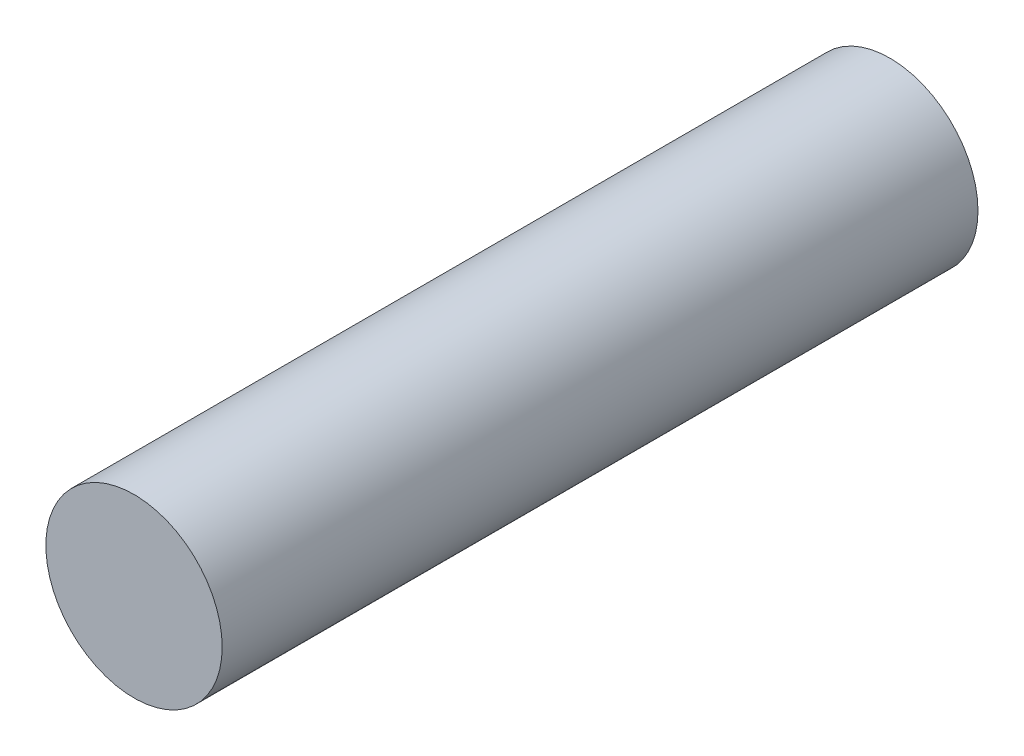
ISO-10303-21;
HEADER;
FILE_DESCRIPTION(('STEP AP214'),'2;1');
FILE_NAME('part.step','',(''),(''),'','','');
FILE_SCHEMA(('AUTOMOTIVE_DESIGN { 1 0 10303 214 1 1 1 1 }'));
ENDSEC;
DATA;
#1=APPLICATION_CONTEXT('core data for automotive mechanical design processes');
#2=APPLICATION_PROTOCOL_DEFINITION('international standard','automotive_design',2000,#1);
#3=PRODUCT_CONTEXT('',#1,'mechanical');
#4=PRODUCT('Part','Part','',(#3));
#5=PRODUCT_RELATED_PRODUCT_CATEGORY('part','',(#4));
#6=PRODUCT_DEFINITION_FORMATION('','',#4);
#7=PRODUCT_DEFINITION_CONTEXT('part definition',#1,'design');
#8=PRODUCT_DEFINITION('design','',#6,#7);
#9=PRODUCT_DEFINITION_SHAPE('','',#8);
#10=(LENGTH_UNIT() NAMED_UNIT(*) SI_UNIT(.MILLI.,.METRE.));
#11=(NAMED_UNIT(*) PLANE_ANGLE_UNIT() SI_UNIT($,.RADIAN.));
#12=(NAMED_UNIT(*) SI_UNIT($,.STERADIAN.) SOLID_ANGLE_UNIT());
#13=UNCERTAINTY_MEASURE_WITH_UNIT(LENGTH_MEASURE(1.E-05),#10,'distance_accuracy_value','');
#14=(GEOMETRIC_REPRESENTATION_CONTEXT(3) GLOBAL_UNCERTAINTY_ASSIGNED_CONTEXT((#13)) GLOBAL_UNIT_ASSIGNED_CONTEXT((#10,
#11,#12)) REPRESENTATION_CONTEXT('',''));
#15=CARTESIAN_POINT('',(0.,0.,0.));
#16=DIRECTION('',(0.,0.,1.));
#17=DIRECTION('',(1.,0.,0.));
#18=AXIS2_PLACEMENT_3D('',#15,#16,#17);
#19=CARTESIAN_POINT('',(-186.657193054549,-243.,60.));
#20=DIRECTION('',(0.,0.,-1.));
#21=DIRECTION('',(-1.,0.,0.));
#22=AXIS2_PLACEMENT_3D('',#19,#20,#21);
#23=CYLINDRICAL_SURFACE('',#22,7.00000000000002);
#24=CARTESIAN_POINT('',(-186.657193054549,-243.,60.));
#25=DIRECTION('',(0.,0.,1.));
#26=DIRECTION('',(1.,0.,0.));
#27=AXIS2_PLACEMENT_3D('',#24,#25,#26);
#28=CIRCLE('',#27,7.00000000000002);
#29=CARTESIAN_POINT('',(-179.657193054549,-243.,60.));
#30=VERTEX_POINT('',#29);
#31=EDGE_CURVE('E10',#30,#30,#28,.T.);
#32=ORIENTED_EDGE('',*,*,#31,.F.);
#33=EDGE_LOOP('',(#32));
#34=FACE_BOUND('',#33,.T.);
#35=CARTESIAN_POINT('',(-186.657193054549,-243.,0.));
#36=DIRECTION('',(0.,0.,1.));
#37=DIRECTION('',(1.,0.,0.));
#38=AXIS2_PLACEMENT_3D('',#35,#36,#37);
#39=CIRCLE('',#38,7.00000000000002);
#40=CARTESIAN_POINT('',(-179.657193054549,-243.,0.));
#41=VERTEX_POINT('',#40);
#42=EDGE_CURVE('E42',#41,#41,#39,.T.);
#43=ORIENTED_EDGE('',*,*,#42,.T.);
#44=EDGE_LOOP('',(#43));
#45=FACE_BOUND('',#44,.T.);
#46=ADVANCED_FACE('F39',(#34,#45),#23,.T.);
#47=CARTESIAN_POINT('',(-186.657193054549,-243.,60.));
#48=DIRECTION('',(0.,0.,1.));
#49=DIRECTION('',(1.,0.,0.));
#50=AXIS2_PLACEMENT_3D('',#47,#48,#49);
#51=PLANE('',#50);
#52=ORIENTED_EDGE('',*,*,#31,.T.);
#53=EDGE_LOOP('',(#52));
#54=FACE_BOUND('',#53,.T.);
#55=ADVANCED_FACE('F54',(#54),#51,.T.);
#56=CARTESIAN_POINT('',(-186.657193054549,-243.,0.));
#57=DIRECTION('',(0.,0.,1.));
#58=DIRECTION('',(1.,0.,0.));
#59=AXIS2_PLACEMENT_3D('',#56,#57,#58);
#60=PLANE('',#59);
#61=ORIENTED_EDGE('',*,*,#42,.F.);
#62=EDGE_LOOP('',(#61));
#63=FACE_BOUND('',#62,.T.);
#64=ADVANCED_FACE('F52',(#63),#60,.F.);
#65=CLOSED_SHELL('',(#46,#55,#64));
#66=MANIFOLD_SOLID_BREP('B2',#65);
#67=ADVANCED_BREP_SHAPE_REPRESENTATION('',(#18,#66),#14);
#68=SHAPE_DEFINITION_REPRESENTATION(#9,#67);
ENDSEC;
END-ISO-10303-21;
